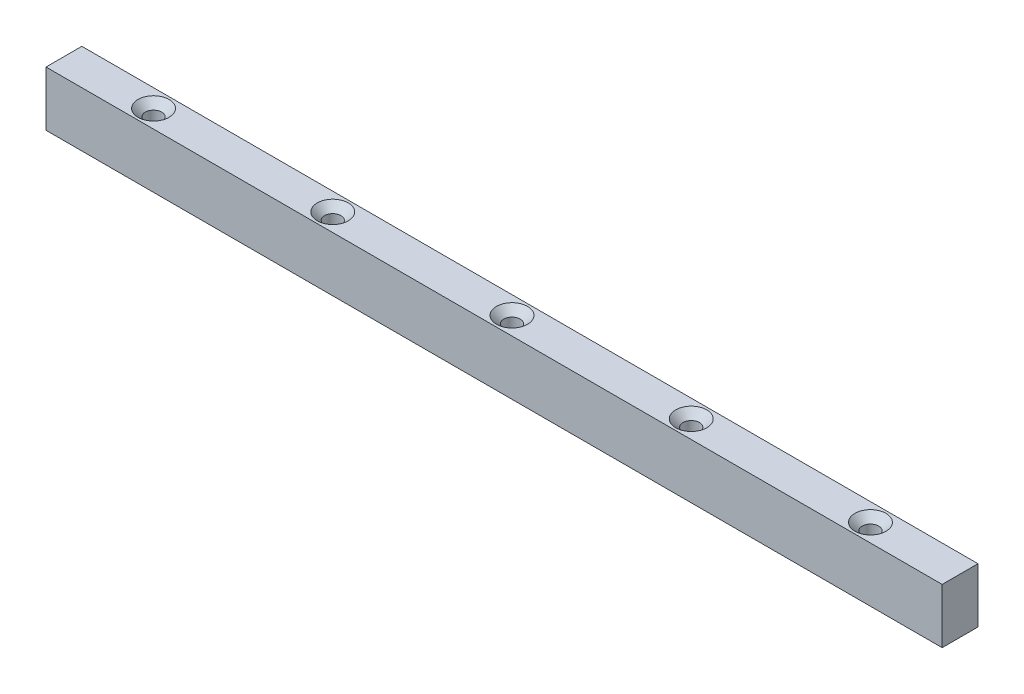
ISO-10303-21;
HEADER;
FILE_DESCRIPTION(('STEP AP214'),'2;1');
FILE_NAME('part.step','',(''),(''),'','','');
FILE_SCHEMA(('AUTOMOTIVE_DESIGN { 1 0 10303 214 1 1 1 1 }'));
ENDSEC;
DATA;
#1=APPLICATION_CONTEXT('core data for automotive mechanical design processes');
#2=APPLICATION_PROTOCOL_DEFINITION('international standard','automotive_design',2000,#1);
#3=PRODUCT_CONTEXT('',#1,'mechanical');
#4=PRODUCT('Part','Part','',(#3));
#5=PRODUCT_RELATED_PRODUCT_CATEGORY('part','',(#4));
#6=PRODUCT_DEFINITION_FORMATION('','',#4);
#7=PRODUCT_DEFINITION_CONTEXT('part definition',#1,'design');
#8=PRODUCT_DEFINITION('design','',#6,#7);
#9=PRODUCT_DEFINITION_SHAPE('','',#8);
#10=(LENGTH_UNIT() NAMED_UNIT(*) SI_UNIT(.MILLI.,.METRE.));
#11=(NAMED_UNIT(*) PLANE_ANGLE_UNIT() SI_UNIT($,.RADIAN.));
#12=(NAMED_UNIT(*) SI_UNIT($,.STERADIAN.) SOLID_ANGLE_UNIT());
#13=UNCERTAINTY_MEASURE_WITH_UNIT(LENGTH_MEASURE(1.E-05),#10,'distance_accuracy_value','');
#14=(GEOMETRIC_REPRESENTATION_CONTEXT(3) GLOBAL_UNCERTAINTY_ASSIGNED_CONTEXT((#13)) GLOBAL_UNIT_ASSIGNED_CONTEXT((#10,
#11,#12)) REPRESENTATION_CONTEXT('',''));
#15=CARTESIAN_POINT('',(0.,0.,0.));
#16=DIRECTION('',(0.,0.,1.));
#17=DIRECTION('',(1.,0.,0.));
#18=AXIS2_PLACEMENT_3D('',#15,#16,#17);
#19=CARTESIAN_POINT('',(-150.,18.35,-12.));
#20=DIRECTION('',(1.,0.,0.));
#21=DIRECTION('',(0.,0.,-1.));
#22=AXIS2_PLACEMENT_3D('',#19,#20,#21);
#23=PLANE('',#22);
#24=DIRECTION('',(0.,0.,1.));
#25=VECTOR('',#24,1.);
#26=CARTESIAN_POINT('',(-150.,0.,-12.));
#27=LINE('',#26,#25);
#28=CARTESIAN_POINT('',(-150.,0.,-12.));
#29=VERTEX_POINT('',#28);
#30=CARTESIAN_POINT('',(-150.,0.,0.));
#31=VERTEX_POINT('',#30);
#32=EDGE_CURVE('E109',#29,#31,#27,.T.);
#33=ORIENTED_EDGE('',*,*,#32,.T.);
#34=DIRECTION('',(0.,-1.,0.));
#35=VECTOR('',#34,1.);
#36=CARTESIAN_POINT('',(-150.,18.35,0.));
#37=LINE('',#36,#35);
#38=CARTESIAN_POINT('',(-150.,18.35,0.));
#39=VERTEX_POINT('',#38);
#40=EDGE_CURVE('E11',#39,#31,#37,.T.);
#41=ORIENTED_EDGE('',*,*,#40,.F.);
#42=DIRECTION('',(0.,0.,1.));
#43=VECTOR('',#42,1.);
#44=CARTESIAN_POINT('',(-150.,18.35,-12.));
#45=LINE('',#44,#43);
#46=CARTESIAN_POINT('',(-150.,18.35,-12.));
#47=VERTEX_POINT('',#46);
#48=EDGE_CURVE('E93',#47,#39,#45,.T.);
#49=ORIENTED_EDGE('',*,*,#48,.F.);
#50=DIRECTION('',(0.,-1.,0.));
#51=VECTOR('',#50,1.);
#52=CARTESIAN_POINT('',(-150.,18.35,-12.));
#53=LINE('',#52,#51);
#54=EDGE_CURVE('E105',#47,#29,#53,.T.);
#55=ORIENTED_EDGE('',*,*,#54,.T.);
#56=EDGE_LOOP('',(#33,#41,#49,#55));
#57=FACE_BOUND('',#56,.T.);
#58=ADVANCED_FACE('F41',(#57),#23,.F.);
#59=CARTESIAN_POINT('',(-150.,18.35,0.));
#60=DIRECTION('',(0.,0.,-1.));
#61=DIRECTION('',(-1.,0.,0.));
#62=AXIS2_PLACEMENT_3D('',#59,#60,#61);
#63=PLANE('',#62);
#64=DIRECTION('',(1.,0.,0.));
#65=VECTOR('',#64,1.);
#66=CARTESIAN_POINT('',(-150.,0.,0.));
#67=LINE('',#66,#65);
#68=CARTESIAN_POINT('',(150.,0.,0.));
#69=VERTEX_POINT('',#68);
#70=EDGE_CURVE('E98',#31,#69,#67,.T.);
#71=ORIENTED_EDGE('',*,*,#70,.T.);
#72=DIRECTION('',(0.,-1.,0.));
#73=VECTOR('',#72,1.);
#74=CARTESIAN_POINT('',(150.,18.35,0.));
#75=LINE('',#74,#73);
#76=CARTESIAN_POINT('',(150.,18.35,0.));
#77=VERTEX_POINT('',#76);
#78=EDGE_CURVE('E50',#77,#69,#75,.T.);
#79=ORIENTED_EDGE('',*,*,#78,.F.);
#80=DIRECTION('',(1.,0.,0.));
#81=VECTOR('',#80,1.);
#82=CARTESIAN_POINT('',(-150.,18.35,0.));
#83=LINE('',#82,#81);
#84=EDGE_CURVE('E88',#39,#77,#83,.T.);
#85=ORIENTED_EDGE('',*,*,#84,.F.);
#86=ORIENTED_EDGE('',*,*,#40,.T.);
#87=EDGE_LOOP('',(#71,#79,#85,#86));
#88=FACE_BOUND('',#87,.T.);
#89=ADVANCED_FACE('F97',(#88),#63,.F.);
#90=CARTESIAN_POINT('',(150.,18.35,-12.0000000000001));
#91=DIRECTION('',(-1.,0.,0.));
#92=DIRECTION('',(0.,0.,1.));
#93=AXIS2_PLACEMENT_3D('',#90,#91,#92);
#94=PLANE('',#93);
#95=DIRECTION('',(0.,0.,-1.));
#96=VECTOR('',#95,1.);
#97=CARTESIAN_POINT('',(150.,0.,-12.0000000000001));
#98=LINE('',#97,#96);
#99=CARTESIAN_POINT('',(150.,0.,-12.0000000000001));
#100=VERTEX_POINT('',#99);
#101=EDGE_CURVE('E75',#69,#100,#98,.T.);
#102=ORIENTED_EDGE('',*,*,#101,.T.);
#103=DIRECTION('',(0.,-1.,0.));
#104=VECTOR('',#103,1.);
#105=CARTESIAN_POINT('',(150.,18.35,-12.0000000000001));
#106=LINE('',#105,#104);
#107=CARTESIAN_POINT('',(150.,18.35,-12.0000000000001));
#108=VERTEX_POINT('',#107);
#109=EDGE_CURVE('E100',#108,#100,#106,.T.);
#110=ORIENTED_EDGE('',*,*,#109,.F.);
#111=DIRECTION('',(0.,0.,-1.));
#112=VECTOR('',#111,1.);
#113=CARTESIAN_POINT('',(150.,18.35,-12.0000000000001));
#114=LINE('',#113,#112);
#115=EDGE_CURVE('E91',#77,#108,#114,.T.);
#116=ORIENTED_EDGE('',*,*,#115,.F.);
#117=ORIENTED_EDGE('',*,*,#78,.T.);
#118=EDGE_LOOP('',(#102,#110,#116,#117));
#119=FACE_BOUND('',#118,.T.);
#120=ADVANCED_FACE('F101',(#119),#94,.F.);
#121=CARTESIAN_POINT('',(-150.,18.35,-12.));
#122=DIRECTION('',(0.,0.,1.));
#123=DIRECTION('',(1.,0.,0.));
#124=AXIS2_PLACEMENT_3D('',#121,#122,#123);
#125=PLANE('',#124);
#126=CARTESIAN_POINT('',(-144.,9.175,-12.));
#127=DIRECTION('',(0.,0.,1.));
#128=DIRECTION('',(1.,0.,0.));
#129=AXIS2_PLACEMENT_3D('',#126,#127,#128);
#130=CIRCLE('',#129,2.99999999999999);
#131=CARTESIAN_POINT('',(-141.,9.175,-12.));
#132=VERTEX_POINT('',#131);
#133=EDGE_CURVE('E198',#132,#132,#130,.T.);
#134=ORIENTED_EDGE('',*,*,#133,.T.);
#135=EDGE_LOOP('',(#134));
#136=FACE_BOUND('',#135,.T.);
#137=CARTESIAN_POINT('',(144.,9.175,-12.));
#138=DIRECTION('',(0.,0.,1.));
#139=DIRECTION('',(1.,0.,0.));
#140=AXIS2_PLACEMENT_3D('',#137,#138,#139);
#141=CIRCLE('',#140,2.99999999999999);
#142=CARTESIAN_POINT('',(147.,9.175,-12.));
#143=VERTEX_POINT('',#142);
#144=EDGE_CURVE('E190',#143,#143,#141,.T.);
#145=ORIENTED_EDGE('',*,*,#144,.T.);
#146=EDGE_LOOP('',(#145));
#147=FACE_BOUND('',#146,.T.);
#148=DIRECTION('',(-1.,0.,0.));
#149=VECTOR('',#148,1.);
#150=CARTESIAN_POINT('',(-150.,0.,-12.));
#151=LINE('',#150,#149);
#152=EDGE_CURVE('E81',#100,#29,#151,.T.);
#153=ORIENTED_EDGE('',*,*,#152,.T.);
#154=ORIENTED_EDGE('',*,*,#54,.F.);
#155=DIRECTION('',(-1.,0.,0.));
#156=VECTOR('',#155,1.);
#157=CARTESIAN_POINT('',(-150.,18.35,-12.));
#158=LINE('',#157,#156);
#159=EDGE_CURVE('E58',#108,#47,#158,.T.);
#160=ORIENTED_EDGE('',*,*,#159,.F.);
#161=ORIENTED_EDGE('',*,*,#109,.T.);
#162=EDGE_LOOP('',(#153,#154,#160,#161));
#163=FACE_BOUND('',#162,.T.);
#164=ADVANCED_FACE('F123',(#136,#147,#163),#125,.F.);
#165=CARTESIAN_POINT('',(0.,18.35,0.));
#166=DIRECTION('',(0.,1.,0.));
#167=DIRECTION('',(0.,0.,1.));
#168=AXIS2_PLACEMENT_3D('',#165,#166,#167);
#169=PLANE('',#168);
#170=CARTESIAN_POINT('',(-120.,18.35,-6.00000000000002));
#171=DIRECTION('',(0.,1.,0.));
#172=DIRECTION('',(0.,0.,1.));
#173=AXIS2_PLACEMENT_3D('',#170,#171,#172);
#174=CIRCLE('',#173,5.2);
#175=CARTESIAN_POINT('',(-120.,18.35,-0.800000000000025));
#176=VERTEX_POINT('',#175);
#177=EDGE_CURVE('E185',#176,#176,#174,.T.);
#178=ORIENTED_EDGE('',*,*,#177,.F.);
#179=EDGE_LOOP('',(#178));
#180=FACE_BOUND('',#179,.T.);
#181=CARTESIAN_POINT('',(-60.,18.35,-6.00000000000003));
#182=DIRECTION('',(0.,1.,0.));
#183=DIRECTION('',(0.,0.,1.));
#184=AXIS2_PLACEMENT_3D('',#181,#182,#183);
#185=CIRCLE('',#184,5.2);
#186=CARTESIAN_POINT('',(-60.,18.35,-0.800000000000026));
#187=VERTEX_POINT('',#186);
#188=EDGE_CURVE('E173',#187,#187,#185,.T.);
#189=ORIENTED_EDGE('',*,*,#188,.F.);
#190=EDGE_LOOP('',(#189));
#191=FACE_BOUND('',#190,.T.);
#192=CARTESIAN_POINT('',(120.,18.35,-6.00000000000005));
#193=DIRECTION('',(0.,1.,0.));
#194=DIRECTION('',(0.,0.,1.));
#195=AXIS2_PLACEMENT_3D('',#192,#193,#194);
#196=CIRCLE('',#195,5.2);
#197=CARTESIAN_POINT('',(120.,18.35,-0.800000000000055));
#198=VERTEX_POINT('',#197);
#199=EDGE_CURVE('E161',#198,#198,#196,.T.);
#200=ORIENTED_EDGE('',*,*,#199,.F.);
#201=EDGE_LOOP('',(#200));
#202=FACE_BOUND('',#201,.T.);
#203=CARTESIAN_POINT('',(60.,18.35,-6.00000000000004));
#204=DIRECTION('',(0.,1.,0.));
#205=DIRECTION('',(0.,0.,1.));
#206=AXIS2_PLACEMENT_3D('',#203,#204,#205);
#207=CIRCLE('',#206,5.2);
#208=CARTESIAN_POINT('',(60.,18.35,-0.80000000000004));
#209=VERTEX_POINT('',#208);
#210=EDGE_CURVE('E149',#209,#209,#207,.T.);
#211=ORIENTED_EDGE('',*,*,#210,.F.);
#212=EDGE_LOOP('',(#211));
#213=FACE_BOUND('',#212,.T.);
#214=CARTESIAN_POINT('',(0.,18.35,-6.00000000000004));
#215=DIRECTION('',(0.,1.,0.));
#216=DIRECTION('',(0.,0.,1.));
#217=AXIS2_PLACEMENT_3D('',#214,#215,#216);
#218=CIRCLE('',#217,5.2);
#219=CARTESIAN_POINT('',(0.,18.35,-0.800000000000036));
#220=VERTEX_POINT('',#219);
#221=EDGE_CURVE('E137',#220,#220,#218,.T.);
#222=ORIENTED_EDGE('',*,*,#221,.F.);
#223=EDGE_LOOP('',(#222));
#224=FACE_BOUND('',#223,.T.);
#225=ORIENTED_EDGE('',*,*,#48,.T.);
#226=ORIENTED_EDGE('',*,*,#84,.T.);
#227=ORIENTED_EDGE('',*,*,#115,.T.);
#228=ORIENTED_EDGE('',*,*,#159,.T.);
#229=EDGE_LOOP('',(#225,#226,#227,#228));
#230=FACE_BOUND('',#229,.T.);
#231=ADVANCED_FACE('F89',(#180,#191,#202,#213,#224,#230),#169,.T.);
#232=CARTESIAN_POINT('',(0.,0.,0.));
#233=DIRECTION('',(0.,1.,0.));
#234=DIRECTION('',(0.,0.,1.));
#235=AXIS2_PLACEMENT_3D('',#232,#233,#234);
#236=PLANE('',#235);
#237=CARTESIAN_POINT('',(-120.,0.,-6.00000000000002));
#238=DIRECTION('',(0.,1.,0.));
#239=DIRECTION('',(0.,0.,1.));
#240=AXIS2_PLACEMENT_3D('',#237,#238,#239);
#241=CIRCLE('',#240,2.74999999999999);
#242=CARTESIAN_POINT('',(-120.,0.,-3.25000000000003));
#243=VERTEX_POINT('',#242);
#244=EDGE_CURVE('E177',#243,#243,#241,.T.);
#245=ORIENTED_EDGE('',*,*,#244,.T.);
#246=EDGE_LOOP('',(#245));
#247=FACE_BOUND('',#246,.T.);
#248=CARTESIAN_POINT('',(-60.,0.,-6.00000000000003));
#249=DIRECTION('',(0.,1.,0.));
#250=DIRECTION('',(0.,0.,1.));
#251=AXIS2_PLACEMENT_3D('',#248,#249,#250);
#252=CIRCLE('',#251,2.75);
#253=CARTESIAN_POINT('',(-60.,0.,-3.25000000000003));
#254=VERTEX_POINT('',#253);
#255=EDGE_CURVE('E165',#254,#254,#252,.T.);
#256=ORIENTED_EDGE('',*,*,#255,.T.);
#257=EDGE_LOOP('',(#256));
#258=FACE_BOUND('',#257,.T.);
#259=CARTESIAN_POINT('',(120.,0.,-6.00000000000005));
#260=DIRECTION('',(0.,1.,0.));
#261=DIRECTION('',(0.,0.,1.));
#262=AXIS2_PLACEMENT_3D('',#259,#260,#261);
#263=CIRCLE('',#262,2.74999999999999);
#264=CARTESIAN_POINT('',(120.,0.,-3.25000000000006));
#265=VERTEX_POINT('',#264);
#266=EDGE_CURVE('E153',#265,#265,#263,.T.);
#267=ORIENTED_EDGE('',*,*,#266,.T.);
#268=EDGE_LOOP('',(#267));
#269=FACE_BOUND('',#268,.T.);
#270=CARTESIAN_POINT('',(60.,0.,-6.00000000000004));
#271=DIRECTION('',(0.,1.,0.));
#272=DIRECTION('',(0.,0.,1.));
#273=AXIS2_PLACEMENT_3D('',#270,#271,#272);
#274=CIRCLE('',#273,2.75);
#275=CARTESIAN_POINT('',(60.,0.,-3.25000000000005));
#276=VERTEX_POINT('',#275);
#277=EDGE_CURVE('E141',#276,#276,#274,.T.);
#278=ORIENTED_EDGE('',*,*,#277,.T.);
#279=EDGE_LOOP('',(#278));
#280=FACE_BOUND('',#279,.T.);
#281=CARTESIAN_POINT('',(0.,0.,-6.00000000000004));
#282=DIRECTION('',(0.,1.,0.));
#283=DIRECTION('',(0.,0.,1.));
#284=AXIS2_PLACEMENT_3D('',#281,#282,#283);
#285=CIRCLE('',#284,2.75);
#286=CARTESIAN_POINT('',(0.,0.,-3.25000000000004));
#287=VERTEX_POINT('',#286);
#288=EDGE_CURVE('E113',#287,#287,#285,.T.);
#289=ORIENTED_EDGE('',*,*,#288,.T.);
#290=EDGE_LOOP('',(#289));
#291=FACE_BOUND('',#290,.T.);
#292=ORIENTED_EDGE('',*,*,#32,.F.);
#293=ORIENTED_EDGE('',*,*,#152,.F.);
#294=ORIENTED_EDGE('',*,*,#101,.F.);
#295=ORIENTED_EDGE('',*,*,#70,.F.);
#296=EDGE_LOOP('',(#292,#293,#294,#295));
#297=FACE_BOUND('',#296,.T.);
#298=ADVANCED_FACE('F126',(#247,#258,#269,#280,#291,#297),#236,.F.);
#299=CARTESIAN_POINT('',(0.,18.35,-6.00000000000004));
#300=DIRECTION('',(0.,1.,0.));
#301=DIRECTION('',(0.,0.,1.));
#302=AXIS2_PLACEMENT_3D('',#299,#300,#301);
#303=CYLINDRICAL_SURFACE('',#302,2.75);
#304=ORIENTED_EDGE('',*,*,#288,.F.);
#305=EDGE_LOOP('',(#304));
#306=FACE_BOUND('',#305,.T.);
#307=CARTESIAN_POINT('',(0.,15.9,-6.00000000000004));
#308=DIRECTION('',(0.,1.,0.));
#309=DIRECTION('',(0.,0.,1.));
#310=AXIS2_PLACEMENT_3D('',#307,#308,#309);
#311=CIRCLE('',#310,2.75);
#312=CARTESIAN_POINT('',(0.,15.9,-3.25000000000004));
#313=VERTEX_POINT('',#312);
#314=EDGE_CURVE('E133',#313,#313,#311,.T.);
#315=ORIENTED_EDGE('',*,*,#314,.T.);
#316=EDGE_LOOP('',(#315));
#317=FACE_BOUND('',#316,.T.);
#318=ADVANCED_FACE('F231',(#306,#317),#303,.F.);
#319=CARTESIAN_POINT('',(0.,18.35,-6.00000000000004));
#320=DIRECTION('',(0.,1.,0.));
#321=DIRECTION('',(0.,0.,1.));
#322=AXIS2_PLACEMENT_3D('',#319,#320,#321);
#323=CONICAL_SURFACE('',#322,5.2,0.785398163397448);
#324=ORIENTED_EDGE('',*,*,#314,.F.);
#325=EDGE_LOOP('',(#324));
#326=FACE_BOUND('',#325,.T.);
#327=ORIENTED_EDGE('',*,*,#221,.T.);
#328=EDGE_LOOP('',(#327));
#329=FACE_BOUND('',#328,.T.);
#330=ADVANCED_FACE('F238',(#326,#329),#323,.F.);
#331=CARTESIAN_POINT('',(60.,18.35,-6.00000000000004));
#332=DIRECTION('',(0.,1.,0.));
#333=DIRECTION('',(0.,0.,1.));
#334=AXIS2_PLACEMENT_3D('',#331,#332,#333);
#335=CYLINDRICAL_SURFACE('',#334,2.75);
#336=ORIENTED_EDGE('',*,*,#277,.F.);
#337=EDGE_LOOP('',(#336));
#338=FACE_BOUND('',#337,.T.);
#339=CARTESIAN_POINT('',(60.,15.9,-6.00000000000004));
#340=DIRECTION('',(0.,1.,0.));
#341=DIRECTION('',(0.,0.,1.));
#342=AXIS2_PLACEMENT_3D('',#339,#340,#341);
#343=CIRCLE('',#342,2.75);
#344=CARTESIAN_POINT('',(60.,15.9,-3.25000000000005));
#345=VERTEX_POINT('',#344);
#346=EDGE_CURVE('E145',#345,#345,#343,.T.);
#347=ORIENTED_EDGE('',*,*,#346,.T.);
#348=EDGE_LOOP('',(#347));
#349=FACE_BOUND('',#348,.T.);
#350=ADVANCED_FACE('F242',(#338,#349),#335,.F.);
#351=CARTESIAN_POINT('',(60.,18.35,-6.00000000000004));
#352=DIRECTION('',(0.,1.,0.));
#353=DIRECTION('',(0.,0.,1.));
#354=AXIS2_PLACEMENT_3D('',#351,#352,#353);
#355=CONICAL_SURFACE('',#354,5.2,0.785398163397449);
#356=ORIENTED_EDGE('',*,*,#346,.F.);
#357=EDGE_LOOP('',(#356));
#358=FACE_BOUND('',#357,.T.);
#359=ORIENTED_EDGE('',*,*,#210,.T.);
#360=EDGE_LOOP('',(#359));
#361=FACE_BOUND('',#360,.T.);
#362=ADVANCED_FACE('F246',(#358,#361),#355,.F.);
#363=CARTESIAN_POINT('',(120.,18.35,-6.00000000000005));
#364=DIRECTION('',(0.,1.,0.));
#365=DIRECTION('',(0.,0.,1.));
#366=AXIS2_PLACEMENT_3D('',#363,#364,#365);
#367=CYLINDRICAL_SURFACE('',#366,2.75);
#368=ORIENTED_EDGE('',*,*,#266,.F.);
#369=EDGE_LOOP('',(#368));
#370=FACE_BOUND('',#369,.T.);
#371=CARTESIAN_POINT('',(120.,15.9,-6.00000000000005));
#372=DIRECTION('',(0.,1.,0.));
#373=DIRECTION('',(0.,0.,1.));
#374=AXIS2_PLACEMENT_3D('',#371,#372,#373);
#375=CIRCLE('',#374,2.75);
#376=CARTESIAN_POINT('',(120.,15.9,-3.25000000000005));
#377=VERTEX_POINT('',#376);
#378=EDGE_CURVE('E157',#377,#377,#375,.T.);
#379=ORIENTED_EDGE('',*,*,#378,.T.);
#380=EDGE_LOOP('',(#379));
#381=FACE_BOUND('',#380,.T.);
#382=ADVANCED_FACE('F250',(#370,#381),#367,.F.);
#383=CARTESIAN_POINT('',(120.,18.35,-6.00000000000005));
#384=DIRECTION('',(0.,1.,0.));
#385=DIRECTION('',(0.,0.,1.));
#386=AXIS2_PLACEMENT_3D('',#383,#384,#385);
#387=CONICAL_SURFACE('',#386,5.2,0.785398163397446);
#388=ORIENTED_EDGE('',*,*,#378,.F.);
#389=EDGE_LOOP('',(#388));
#390=FACE_BOUND('',#389,.T.);
#391=ORIENTED_EDGE('',*,*,#199,.T.);
#392=EDGE_LOOP('',(#391));
#393=FACE_BOUND('',#392,.T.);
#394=ADVANCED_FACE('F254',(#390,#393),#387,.F.);
#395=CARTESIAN_POINT('',(-60.,18.35,-6.00000000000003));
#396=DIRECTION('',(0.,1.,0.));
#397=DIRECTION('',(0.,0.,1.));
#398=AXIS2_PLACEMENT_3D('',#395,#396,#397);
#399=CYLINDRICAL_SURFACE('',#398,2.75);
#400=ORIENTED_EDGE('',*,*,#255,.F.);
#401=EDGE_LOOP('',(#400));
#402=FACE_BOUND('',#401,.T.);
#403=CARTESIAN_POINT('',(-60.,15.9,-6.00000000000003));
#404=DIRECTION('',(0.,1.,0.));
#405=DIRECTION('',(0.,0.,1.));
#406=AXIS2_PLACEMENT_3D('',#403,#404,#405);
#407=CIRCLE('',#406,2.75);
#408=CARTESIAN_POINT('',(-60.,15.9,-3.25000000000003));
#409=VERTEX_POINT('',#408);
#410=EDGE_CURVE('E169',#409,#409,#407,.T.);
#411=ORIENTED_EDGE('',*,*,#410,.T.);
#412=EDGE_LOOP('',(#411));
#413=FACE_BOUND('',#412,.T.);
#414=ADVANCED_FACE('F258',(#402,#413),#399,.F.);
#415=CARTESIAN_POINT('',(-60.,18.35,-6.00000000000003));
#416=DIRECTION('',(0.,1.,0.));
#417=DIRECTION('',(0.,0.,1.));
#418=AXIS2_PLACEMENT_3D('',#415,#416,#417);
#419=CONICAL_SURFACE('',#418,5.2,0.785398163397449);
#420=ORIENTED_EDGE('',*,*,#410,.F.);
#421=EDGE_LOOP('',(#420));
#422=FACE_BOUND('',#421,.T.);
#423=ORIENTED_EDGE('',*,*,#188,.T.);
#424=EDGE_LOOP('',(#423));
#425=FACE_BOUND('',#424,.T.);
#426=ADVANCED_FACE('F262',(#422,#425),#419,.F.);
#427=CARTESIAN_POINT('',(-120.,18.35,-6.00000000000002));
#428=DIRECTION('',(0.,1.,0.));
#429=DIRECTION('',(0.,0.,1.));
#430=AXIS2_PLACEMENT_3D('',#427,#428,#429);
#431=CYLINDRICAL_SURFACE('',#430,2.75);
#432=ORIENTED_EDGE('',*,*,#244,.F.);
#433=EDGE_LOOP('',(#432));
#434=FACE_BOUND('',#433,.T.);
#435=CARTESIAN_POINT('',(-120.,15.9,-6.00000000000002));
#436=DIRECTION('',(0.,1.,0.));
#437=DIRECTION('',(0.,0.,1.));
#438=AXIS2_PLACEMENT_3D('',#435,#436,#437);
#439=CIRCLE('',#438,2.75);
#440=CARTESIAN_POINT('',(-120.,15.9,-3.25000000000002));
#441=VERTEX_POINT('',#440);
#442=EDGE_CURVE('E181',#441,#441,#439,.T.);
#443=ORIENTED_EDGE('',*,*,#442,.T.);
#444=EDGE_LOOP('',(#443));
#445=FACE_BOUND('',#444,.T.);
#446=ADVANCED_FACE('F266',(#434,#445),#431,.F.);
#447=CARTESIAN_POINT('',(-120.,18.35,-6.00000000000002));
#448=DIRECTION('',(0.,1.,0.));
#449=DIRECTION('',(0.,0.,1.));
#450=AXIS2_PLACEMENT_3D('',#447,#448,#449);
#451=CONICAL_SURFACE('',#450,5.2,0.785398163397446);
#452=ORIENTED_EDGE('',*,*,#442,.F.);
#453=EDGE_LOOP('',(#452));
#454=FACE_BOUND('',#453,.T.);
#455=ORIENTED_EDGE('',*,*,#177,.T.);
#456=EDGE_LOOP('',(#455));
#457=FACE_BOUND('',#456,.T.);
#458=ADVANCED_FACE('F270',(#454,#457),#451,.F.);
#459=CARTESIAN_POINT('',(144.,9.175,-1.00000000000005));
#460=DIRECTION('',(0.,0.,-1.));
#461=DIRECTION('',(-1.,0.,0.));
#462=AXIS2_PLACEMENT_3D('',#459,#460,#461);
#463=CYLINDRICAL_SURFACE('',#462,2.99999999999999);
#464=CARTESIAN_POINT('',(144.,9.175,-1.00000000000005));
#465=DIRECTION('',(0.,0.,1.));
#466=DIRECTION('',(1.,0.,0.));
#467=AXIS2_PLACEMENT_3D('',#464,#465,#466);
#468=CIRCLE('',#467,2.99999999999999);
#469=CARTESIAN_POINT('',(147.,9.175,-1.00000000000005));
#470=VERTEX_POINT('',#469);
#471=EDGE_CURVE('E194',#470,#470,#468,.T.);
#472=ORIENTED_EDGE('',*,*,#471,.T.);
#473=EDGE_LOOP('',(#472));
#474=FACE_BOUND('',#473,.T.);
#475=ORIENTED_EDGE('',*,*,#144,.F.);
#476=EDGE_LOOP('',(#475));
#477=FACE_BOUND('',#476,.T.);
#478=ADVANCED_FACE('F274',(#474,#477),#463,.F.);
#479=CARTESIAN_POINT('',(144.,9.175,-1.00000000000005));
#480=DIRECTION('',(0.,0.,1.));
#481=DIRECTION('',(1.,0.,0.));
#482=AXIS2_PLACEMENT_3D('',#479,#480,#481);
#483=PLANE('',#482);
#484=ORIENTED_EDGE('',*,*,#471,.F.);
#485=EDGE_LOOP('',(#484));
#486=FACE_BOUND('',#485,.T.);
#487=ADVANCED_FACE('F215',(#486),#483,.F.);
#488=CARTESIAN_POINT('',(-144.,9.175,-1.00000000000005));
#489=DIRECTION('',(0.,0.,-1.));
#490=DIRECTION('',(-1.,0.,0.));
#491=AXIS2_PLACEMENT_3D('',#488,#489,#490);
#492=CYLINDRICAL_SURFACE('',#491,2.99999999999999);
#493=CARTESIAN_POINT('',(-144.,9.175,-1.00000000000005));
#494=DIRECTION('',(0.,0.,1.));
#495=DIRECTION('',(1.,0.,0.));
#496=AXIS2_PLACEMENT_3D('',#493,#494,#495);
#497=CIRCLE('',#496,2.99999999999999);
#498=CARTESIAN_POINT('',(-141.,9.175,-1.00000000000005));
#499=VERTEX_POINT('',#498);
#500=EDGE_CURVE('E189',#499,#499,#497,.T.);
#501=ORIENTED_EDGE('',*,*,#500,.T.);
#502=EDGE_LOOP('',(#501));
#503=FACE_BOUND('',#502,.T.);
#504=ORIENTED_EDGE('',*,*,#133,.F.);
#505=EDGE_LOOP('',(#504));
#506=FACE_BOUND('',#505,.T.);
#507=ADVANCED_FACE('F206',(#503,#506),#492,.F.);
#508=CARTESIAN_POINT('',(-144.,9.175,-1.00000000000005));
#509=DIRECTION('',(0.,0.,1.));
#510=DIRECTION('',(1.,0.,0.));
#511=AXIS2_PLACEMENT_3D('',#508,#509,#510);
#512=PLANE('',#511);
#513=ORIENTED_EDGE('',*,*,#500,.F.);
#514=EDGE_LOOP('',(#513));
#515=FACE_BOUND('',#514,.T.);
#516=ADVANCED_FACE('F209',(#515),#512,.F.);
#517=CLOSED_SHELL('',(#58,#89,#120,#164,#231,#298,#318,#330,#350,#362,#382,#394,#414,#426,#446,
#458,#478,#487,#507,#516));
#518=MANIFOLD_SOLID_BREP('B2',#517);
#519=ADVANCED_BREP_SHAPE_REPRESENTATION('',(#18,#518),#14);
#520=SHAPE_DEFINITION_REPRESENTATION(#9,#519);
ENDSEC;
END-ISO-10303-21;
